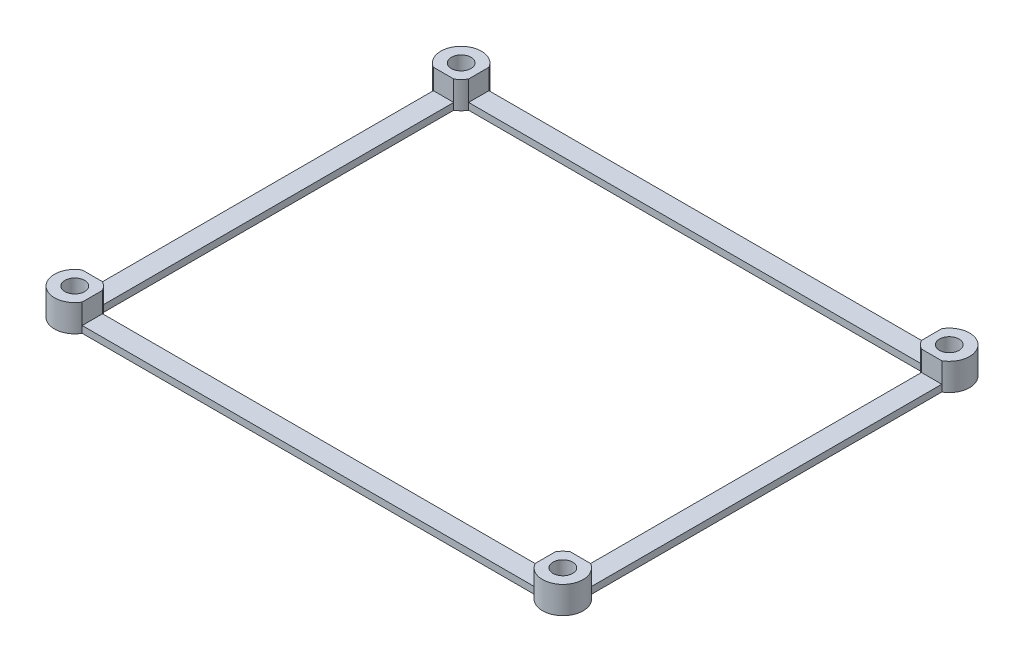
ISO-10303-21;
HEADER;
FILE_DESCRIPTION(('STEP AP214'),'2;1');
FILE_NAME('part.step','',(''),(''),'','','');
FILE_SCHEMA(('AUTOMOTIVE_DESIGN { 1 0 10303 214 1 1 1 1 }'));
ENDSEC;
DATA;
#1=APPLICATION_CONTEXT('core data for automotive mechanical design processes');
#2=APPLICATION_PROTOCOL_DEFINITION('international standard','automotive_design',2000,#1);
#3=PRODUCT_CONTEXT('',#1,'mechanical');
#4=PRODUCT('Part','Part','',(#3));
#5=PRODUCT_RELATED_PRODUCT_CATEGORY('part','',(#4));
#6=PRODUCT_DEFINITION_FORMATION('','',#4);
#7=PRODUCT_DEFINITION_CONTEXT('part definition',#1,'design');
#8=PRODUCT_DEFINITION('design','',#6,#7);
#9=PRODUCT_DEFINITION_SHAPE('','',#8);
#10=(LENGTH_UNIT() NAMED_UNIT(*) SI_UNIT(.MILLI.,.METRE.));
#11=(NAMED_UNIT(*) PLANE_ANGLE_UNIT() SI_UNIT($,.RADIAN.));
#12=(NAMED_UNIT(*) SI_UNIT($,.STERADIAN.) SOLID_ANGLE_UNIT());
#13=UNCERTAINTY_MEASURE_WITH_UNIT(LENGTH_MEASURE(1.E-05),#10,'distance_accuracy_value','');
#14=(GEOMETRIC_REPRESENTATION_CONTEXT(3) GLOBAL_UNCERTAINTY_ASSIGNED_CONTEXT((#13)) GLOBAL_UNIT_ASSIGNED_CONTEXT((#10,
#11,#12)) REPRESENTATION_CONTEXT('',''));
#15=CARTESIAN_POINT('',(0.,0.,0.));
#16=DIRECTION('',(0.,0.,1.));
#17=DIRECTION('',(1.,0.,0.));
#18=AXIS2_PLACEMENT_3D('',#15,#16,#17);
#19=CARTESIAN_POINT('',(36.,4.,-28.5));
#20=DIRECTION('',(0.,1.,0.));
#21=DIRECTION('',(0.,0.,1.));
#22=AXIS2_PLACEMENT_3D('',#19,#20,#21);
#23=PLANE('',#22);
#24=DIRECTION('',(-1.,0.,0.));
#25=VECTOR('',#24,1.);
#26=CARTESIAN_POINT('',(-37.5,4.,-25.9019237886467));
#27=LINE('',#26,#25);
#28=CARTESIAN_POINT('',(-34.5,4.,-25.9019237886467));
#29=VERTEX_POINT('',#28);
#30=CARTESIAN_POINT('',(-37.5,4.,-25.9019237886467));
#31=VERTEX_POINT('',#30);
#32=EDGE_CURVE('E224',#29,#31,#27,.T.);
#33=ORIENTED_EDGE('',*,*,#32,.F.);
#34=CARTESIAN_POINT('',(-36.,4.,-28.5));
#35=DIRECTION('',(0.,-1.,0.));
#36=DIRECTION('',(0.,0.,1.));
#37=AXIS2_PLACEMENT_3D('',#34,#35,#36);
#38=CIRCLE('',#37,3.);
#39=CARTESIAN_POINT('',(-33.4019237886467,4.,-27.));
#40=VERTEX_POINT('',#39);
#41=EDGE_CURVE('E323',#40,#29,#38,.T.);
#42=ORIENTED_EDGE('',*,*,#41,.F.);
#43=DIRECTION('',(0.,0.,1.));
#44=VECTOR('',#43,1.);
#45=CARTESIAN_POINT('',(-33.4019237886467,4.,-27.));
#46=LINE('',#45,#44);
#47=CARTESIAN_POINT('',(-33.4019237886467,4.,-30.));
#48=VERTEX_POINT('',#47);
#49=EDGE_CURVE('E322',#48,#40,#46,.T.);
#50=ORIENTED_EDGE('',*,*,#49,.F.);
#51=CARTESIAN_POINT('',(-36.,4.,-28.5));
#52=DIRECTION('',(0.,1.,0.));
#53=DIRECTION('',(0.,0.,1.));
#54=AXIS2_PLACEMENT_3D('',#51,#52,#53);
#55=CIRCLE('',#54,3.);
#56=EDGE_CURVE('E233',#48,#31,#55,.T.);
#57=ORIENTED_EDGE('',*,*,#56,.T.);
#58=EDGE_LOOP('',(#33,#42,#50,#57));
#59=FACE_BOUND('',#58,.T.);
#60=CARTESIAN_POINT('',(-36.,4.,-28.5));
#61=DIRECTION('',(0.,1.,0.));
#62=DIRECTION('',(0.,0.,1.));
#63=AXIS2_PLACEMENT_3D('',#60,#61,#62);
#64=CIRCLE('',#63,1.45);
#65=CARTESIAN_POINT('',(-36.,4.,-27.05));
#66=VERTEX_POINT('',#65);
#67=EDGE_CURVE('E395',#66,#66,#64,.T.);
#68=ORIENTED_EDGE('',*,*,#67,.F.);
#69=EDGE_LOOP('',(#68));
#70=FACE_BOUND('',#69,.T.);
#71=ADVANCED_FACE('F39',(#59,#70),#23,.T.);
#72=DIRECTION('',(1.,0.,0.));
#73=VECTOR('',#72,1.);
#74=CARTESIAN_POINT('',(-37.5,4.,25.9019237886467));
#75=LINE('',#74,#73);
#76=CARTESIAN_POINT('',(-37.5,4.,25.9019237886467));
#77=VERTEX_POINT('',#76);
#78=CARTESIAN_POINT('',(-34.5,4.,25.9019237886467));
#79=VERTEX_POINT('',#78);
#80=EDGE_CURVE('E204',#77,#79,#75,.T.);
#81=ORIENTED_EDGE('',*,*,#80,.F.);
#82=CARTESIAN_POINT('',(-36.,4.,28.5));
#83=DIRECTION('',(0.,1.,0.));
#84=DIRECTION('',(0.,0.,1.));
#85=AXIS2_PLACEMENT_3D('',#82,#83,#84);
#86=CIRCLE('',#85,3.00000000000001);
#87=CARTESIAN_POINT('',(-33.4019237886467,4.,30.));
#88=VERTEX_POINT('',#87);
#89=EDGE_CURVE('E220',#77,#88,#86,.T.);
#90=ORIENTED_EDGE('',*,*,#89,.T.);
#91=DIRECTION('',(0.,0.,1.));
#92=VECTOR('',#91,1.);
#93=CARTESIAN_POINT('',(-33.4019237886467,4.,27.));
#94=LINE('',#93,#92);
#95=CARTESIAN_POINT('',(-33.4019237886467,4.,27.));
#96=VERTEX_POINT('',#95);
#97=EDGE_CURVE('E438',#96,#88,#94,.T.);
#98=ORIENTED_EDGE('',*,*,#97,.F.);
#99=CARTESIAN_POINT('',(-36.,4.,28.5));
#100=DIRECTION('',(0.,-1.,0.));
#101=DIRECTION('',(0.,0.,1.));
#102=AXIS2_PLACEMENT_3D('',#99,#100,#101);
#103=CIRCLE('',#102,3.00000000000001);
#104=EDGE_CURVE('E223',#79,#96,#103,.T.);
#105=ORIENTED_EDGE('',*,*,#104,.F.);
#106=EDGE_LOOP('',(#81,#90,#98,#105));
#107=FACE_BOUND('',#106,.T.);
#108=CARTESIAN_POINT('',(-36.,4.,28.5));
#109=DIRECTION('',(0.,1.,0.));
#110=DIRECTION('',(0.,0.,1.));
#111=AXIS2_PLACEMENT_3D('',#108,#109,#110);
#112=CIRCLE('',#111,1.45);
#113=CARTESIAN_POINT('',(-36.,4.,29.95));
#114=VERTEX_POINT('',#113);
#115=EDGE_CURVE('E401',#114,#114,#112,.T.);
#116=ORIENTED_EDGE('',*,*,#115,.F.);
#117=EDGE_LOOP('',(#116));
#118=FACE_BOUND('',#117,.T.);
#119=ADVANCED_FACE('F217',(#107,#118),#23,.T.);
#120=DIRECTION('',(-1.,0.,0.));
#121=VECTOR('',#120,1.);
#122=CARTESIAN_POINT('',(34.5,4.,-25.9019237886467));
#123=LINE('',#122,#121);
#124=CARTESIAN_POINT('',(37.5,4.,-25.9019237886467));
#125=VERTEX_POINT('',#124);
#126=CARTESIAN_POINT('',(34.5,4.,-25.9019237886467));
#127=VERTEX_POINT('',#126);
#128=EDGE_CURVE('E425',#125,#127,#123,.T.);
#129=ORIENTED_EDGE('',*,*,#128,.F.);
#130=CARTESIAN_POINT('',(36.,4.,-28.5));
#131=DIRECTION('',(0.,1.,0.));
#132=DIRECTION('',(0.,0.,1.));
#133=AXIS2_PLACEMENT_3D('',#130,#131,#132);
#134=CIRCLE('',#133,3.);
#135=CARTESIAN_POINT('',(33.4019237886467,4.,-30.));
#136=VERTEX_POINT('',#135);
#137=EDGE_CURVE('E239',#125,#136,#134,.T.);
#138=ORIENTED_EDGE('',*,*,#137,.T.);
#139=DIRECTION('',(0.,0.,-1.));
#140=VECTOR('',#139,1.);
#141=CARTESIAN_POINT('',(33.4019237886467,4.,-27.));
#142=LINE('',#141,#140);
#143=CARTESIAN_POINT('',(33.4019237886467,4.,-27.));
#144=VERTEX_POINT('',#143);
#145=EDGE_CURVE('E325',#144,#136,#142,.T.);
#146=ORIENTED_EDGE('',*,*,#145,.F.);
#147=CARTESIAN_POINT('',(36.,4.,-28.5));
#148=DIRECTION('',(0.,-1.,0.));
#149=DIRECTION('',(0.,0.,1.));
#150=AXIS2_PLACEMENT_3D('',#147,#148,#149);
#151=CIRCLE('',#150,3.);
#152=EDGE_CURVE('E342',#127,#144,#151,.T.);
#153=ORIENTED_EDGE('',*,*,#152,.F.);
#154=EDGE_LOOP('',(#129,#138,#146,#153));
#155=FACE_BOUND('',#154,.T.);
#156=CARTESIAN_POINT('',(36.,4.,-28.5));
#157=DIRECTION('',(0.,1.,0.));
#158=DIRECTION('',(0.,0.,1.));
#159=AXIS2_PLACEMENT_3D('',#156,#157,#158);
#160=CIRCLE('',#159,1.45);
#161=CARTESIAN_POINT('',(36.,4.,-27.05));
#162=VERTEX_POINT('',#161);
#163=EDGE_CURVE('E247',#162,#162,#160,.T.);
#164=ORIENTED_EDGE('',*,*,#163,.F.);
#165=EDGE_LOOP('',(#164));
#166=FACE_BOUND('',#165,.T.);
#167=ADVANCED_FACE('F422',(#155,#166),#23,.T.);
#168=CARTESIAN_POINT('',(-33.4019237886467,4.,-30.));
#169=DIRECTION('',(0.,0.,1.));
#170=DIRECTION('',(1.,0.,0.));
#171=AXIS2_PLACEMENT_3D('',#168,#169,#170);
#172=PLANE('',#171);
#173=DIRECTION('',(1.,0.,0.));
#174=VECTOR('',#173,1.);
#175=CARTESIAN_POINT('',(33.4019237886467,1.,-30.));
#176=LINE('',#175,#174);
#177=CARTESIAN_POINT('',(-33.4019237886467,1.,-30.));
#178=VERTEX_POINT('',#177);
#179=CARTESIAN_POINT('',(33.4019237886467,1.,-30.));
#180=VERTEX_POINT('',#179);
#181=EDGE_CURVE('E332',#178,#180,#176,.T.);
#182=ORIENTED_EDGE('',*,*,#181,.T.);
#183=DIRECTION('',(0.,-1.,0.));
#184=VECTOR('',#183,1.);
#185=CARTESIAN_POINT('',(33.4019237886467,4.,-30.));
#186=LINE('',#185,#184);
#187=CARTESIAN_POINT('',(33.4019237886467,0.,-30.));
#188=VERTEX_POINT('',#187);
#189=EDGE_CURVE('E47',#180,#188,#186,.T.);
#190=ORIENTED_EDGE('',*,*,#189,.T.);
#191=DIRECTION('',(-1.,0.,0.));
#192=VECTOR('',#191,1.);
#193=CARTESIAN_POINT('',(-33.4019237886467,0.,-30.));
#194=LINE('',#193,#192);
#195=CARTESIAN_POINT('',(-33.4019237886467,0.,-30.));
#196=VERTEX_POINT('',#195);
#197=EDGE_CURVE('E246',#188,#196,#194,.T.);
#198=ORIENTED_EDGE('',*,*,#197,.T.);
#199=DIRECTION('',(0.,-1.,0.));
#200=VECTOR('',#199,1.);
#201=CARTESIAN_POINT('',(-33.4019237886467,4.,-30.));
#202=LINE('',#201,#200);
#203=EDGE_CURVE('E281',#178,#196,#202,.T.);
#204=ORIENTED_EDGE('',*,*,#203,.F.);
#205=EDGE_LOOP('',(#182,#190,#198,#204));
#206=FACE_BOUND('',#205,.T.);
#207=ADVANCED_FACE('F294',(#206),#172,.F.);
#208=CARTESIAN_POINT('',(-37.5,4.,25.9019237886467));
#209=DIRECTION('',(1.,0.,0.));
#210=DIRECTION('',(0.,0.,-1.));
#211=AXIS2_PLACEMENT_3D('',#208,#209,#210);
#212=PLANE('',#211);
#213=DIRECTION('',(0.,0.,-1.));
#214=VECTOR('',#213,1.);
#215=CARTESIAN_POINT('',(-37.5,1.,-25.9019237886467));
#216=LINE('',#215,#214);
#217=CARTESIAN_POINT('',(-37.5,1.,25.9019237886467));
#218=VERTEX_POINT('',#217);
#219=CARTESIAN_POINT('',(-37.5,1.,-25.9019237886467));
#220=VERTEX_POINT('',#219);
#221=EDGE_CURVE('E306',#218,#220,#216,.T.);
#222=ORIENTED_EDGE('',*,*,#221,.T.);
#223=DIRECTION('',(0.,-1.,0.));
#224=VECTOR('',#223,1.);
#225=CARTESIAN_POINT('',(-37.5,4.,-25.9019237886467));
#226=LINE('',#225,#224);
#227=CARTESIAN_POINT('',(-37.5,0.,-25.9019237886467));
#228=VERTEX_POINT('',#227);
#229=EDGE_CURVE('E211',#220,#228,#226,.T.);
#230=ORIENTED_EDGE('',*,*,#229,.T.);
#231=DIRECTION('',(0.,0.,1.));
#232=VECTOR('',#231,1.);
#233=CARTESIAN_POINT('',(-37.5,0.,25.9019237886467));
#234=LINE('',#233,#232);
#235=CARTESIAN_POINT('',(-37.5,0.,25.9019237886467));
#236=VERTEX_POINT('',#235);
#237=EDGE_CURVE('E253',#228,#236,#234,.T.);
#238=ORIENTED_EDGE('',*,*,#237,.T.);
#239=DIRECTION('',(0.,-1.,0.));
#240=VECTOR('',#239,1.);
#241=CARTESIAN_POINT('',(-37.5,4.,25.9019237886467));
#242=LINE('',#241,#240);
#243=EDGE_CURVE('E212',#218,#236,#242,.T.);
#244=ORIENTED_EDGE('',*,*,#243,.F.);
#245=EDGE_LOOP('',(#222,#230,#238,#244));
#246=FACE_BOUND('',#245,.T.);
#247=ADVANCED_FACE('F305',(#246),#212,.F.);
#248=CARTESIAN_POINT('',(-33.4019237886467,4.,30.));
#249=DIRECTION('',(0.,0.,-1.));
#250=DIRECTION('',(-1.,0.,0.));
#251=AXIS2_PLACEMENT_3D('',#248,#249,#250);
#252=PLANE('',#251);
#253=DIRECTION('',(-1.,0.,0.));
#254=VECTOR('',#253,1.);
#255=CARTESIAN_POINT('',(-33.4019237886467,1.,30.));
#256=LINE('',#255,#254);
#257=CARTESIAN_POINT('',(33.4019237886467,1.,30.));
#258=VERTEX_POINT('',#257);
#259=CARTESIAN_POINT('',(-33.4019237886467,1.,30.));
#260=VERTEX_POINT('',#259);
#261=EDGE_CURVE('E225',#258,#260,#256,.T.);
#262=ORIENTED_EDGE('',*,*,#261,.T.);
#263=DIRECTION('',(0.,-1.,0.));
#264=VECTOR('',#263,1.);
#265=CARTESIAN_POINT('',(-33.4019237886467,4.,30.));
#266=LINE('',#265,#264);
#267=CARTESIAN_POINT('',(-33.4019237886467,0.,30.));
#268=VERTEX_POINT('',#267);
#269=EDGE_CURVE('E277',#260,#268,#266,.T.);
#270=ORIENTED_EDGE('',*,*,#269,.T.);
#271=DIRECTION('',(1.,0.,0.));
#272=VECTOR('',#271,1.);
#273=CARTESIAN_POINT('',(-33.4019237886467,0.,30.));
#274=LINE('',#273,#272);
#275=CARTESIAN_POINT('',(33.4019237886467,0.,30.));
#276=VERTEX_POINT('',#275);
#277=EDGE_CURVE('E258',#268,#276,#274,.T.);
#278=ORIENTED_EDGE('',*,*,#277,.T.);
#279=DIRECTION('',(0.,-1.,0.));
#280=VECTOR('',#279,1.);
#281=CARTESIAN_POINT('',(33.4019237886467,4.,30.));
#282=LINE('',#281,#280);
#283=EDGE_CURVE('E273',#258,#276,#282,.T.);
#284=ORIENTED_EDGE('',*,*,#283,.F.);
#285=EDGE_LOOP('',(#262,#270,#278,#284));
#286=FACE_BOUND('',#285,.T.);
#287=ADVANCED_FACE('F520',(#286),#252,.F.);
#288=CARTESIAN_POINT('',(37.5,4.,25.9019237886467));
#289=DIRECTION('',(-1.,0.,0.));
#290=DIRECTION('',(0.,0.,1.));
#291=AXIS2_PLACEMENT_3D('',#288,#289,#290);
#292=PLANE('',#291);
#293=DIRECTION('',(0.,0.,1.));
#294=VECTOR('',#293,1.);
#295=CARTESIAN_POINT('',(37.5,1.,25.9019237886467));
#296=LINE('',#295,#294);
#297=CARTESIAN_POINT('',(37.5,1.,-25.9019237886467));
#298=VERTEX_POINT('',#297);
#299=CARTESIAN_POINT('',(37.5,1.,25.9019237886467));
#300=VERTEX_POINT('',#299);
#301=EDGE_CURVE('E441',#298,#300,#296,.T.);
#302=ORIENTED_EDGE('',*,*,#301,.T.);
#303=DIRECTION('',(0.,-1.,0.));
#304=VECTOR('',#303,1.);
#305=CARTESIAN_POINT('',(37.5,4.,25.9019237886467));
#306=LINE('',#305,#304);
#307=CARTESIAN_POINT('',(37.5,0.,25.9019237886467));
#308=VERTEX_POINT('',#307);
#309=EDGE_CURVE('E270',#300,#308,#306,.T.);
#310=ORIENTED_EDGE('',*,*,#309,.T.);
#311=DIRECTION('',(0.,0.,-1.));
#312=VECTOR('',#311,1.);
#313=CARTESIAN_POINT('',(37.5,0.,25.9019237886467));
#314=LINE('',#313,#312);
#315=CARTESIAN_POINT('',(37.5,0.,-25.9019237886467));
#316=VERTEX_POINT('',#315);
#317=EDGE_CURVE('E264',#308,#316,#314,.T.);
#318=ORIENTED_EDGE('',*,*,#317,.T.);
#319=DIRECTION('',(0.,-1.,0.));
#320=VECTOR('',#319,1.);
#321=CARTESIAN_POINT('',(37.5,4.,-25.9019237886467));
#322=LINE('',#321,#320);
#323=EDGE_CURVE('E236',#298,#316,#322,.T.);
#324=ORIENTED_EDGE('',*,*,#323,.F.);
#325=EDGE_LOOP('',(#302,#310,#318,#324));
#326=FACE_BOUND('',#325,.T.);
#327=ADVANCED_FACE('F530',(#326),#292,.F.);
#328=CARTESIAN_POINT('',(-34.5,4.,25.9019237886467));
#329=DIRECTION('',(1.,0.,0.));
#330=DIRECTION('',(0.,0.,-1.));
#331=AXIS2_PLACEMENT_3D('',#328,#329,#330);
#332=PLANE('',#331);
#333=DIRECTION('',(0.,-1.,0.));
#334=VECTOR('',#333,1.);
#335=CARTESIAN_POINT('',(-34.5,4.,-25.9019237886467));
#336=LINE('',#335,#334);
#337=CARTESIAN_POINT('',(-34.5,1.,-25.9019237886467));
#338=VERTEX_POINT('',#337);
#339=CARTESIAN_POINT('',(-34.5,0.,-25.9019237886467));
#340=VERTEX_POINT('',#339);
#341=EDGE_CURVE('E392',#338,#340,#336,.T.);
#342=ORIENTED_EDGE('',*,*,#341,.F.);
#343=DIRECTION('',(0.,0.,1.));
#344=VECTOR('',#343,1.);
#345=CARTESIAN_POINT('',(-34.5,1.,-25.9019237886467));
#346=LINE('',#345,#344);
#347=CARTESIAN_POINT('',(-34.5,1.,25.9019237886467));
#348=VERTEX_POINT('',#347);
#349=EDGE_CURVE('E318',#338,#348,#346,.T.);
#350=ORIENTED_EDGE('',*,*,#349,.T.);
#351=DIRECTION('',(0.,-1.,0.));
#352=VECTOR('',#351,1.);
#353=CARTESIAN_POINT('',(-34.5,4.,25.9019237886467));
#354=LINE('',#353,#352);
#355=CARTESIAN_POINT('',(-34.5,0.,25.9019237886467));
#356=VERTEX_POINT('',#355);
#357=EDGE_CURVE('E389',#348,#356,#354,.T.);
#358=ORIENTED_EDGE('',*,*,#357,.T.);
#359=DIRECTION('',(0.,0.,1.));
#360=VECTOR('',#359,1.);
#361=CARTESIAN_POINT('',(-34.5,0.,25.9019237886467));
#362=LINE('',#361,#360);
#363=EDGE_CURVE('E348',#340,#356,#362,.T.);
#364=ORIENTED_EDGE('',*,*,#363,.F.);
#365=EDGE_LOOP('',(#342,#350,#358,#364));
#366=FACE_BOUND('',#365,.T.);
#367=ADVANCED_FACE('F468',(#366),#332,.T.);
#368=CARTESIAN_POINT('',(-33.4019237886467,4.,27.));
#369=DIRECTION('',(0.,0.,-1.));
#370=DIRECTION('',(-1.,0.,0.));
#371=AXIS2_PLACEMENT_3D('',#368,#369,#370);
#372=PLANE('',#371);
#373=DIRECTION('',(0.,-1.,0.));
#374=VECTOR('',#373,1.);
#375=CARTESIAN_POINT('',(-33.4019237886467,4.,27.));
#376=LINE('',#375,#374);
#377=CARTESIAN_POINT('',(-33.4019237886467,1.,27.));
#378=VERTEX_POINT('',#377);
#379=CARTESIAN_POINT('',(-33.4019237886467,0.,27.));
#380=VERTEX_POINT('',#379);
#381=EDGE_CURVE('E385',#378,#380,#376,.T.);
#382=ORIENTED_EDGE('',*,*,#381,.F.);
#383=DIRECTION('',(1.,0.,0.));
#384=VECTOR('',#383,1.);
#385=CARTESIAN_POINT('',(-33.4019237886467,1.,27.));
#386=LINE('',#385,#384);
#387=CARTESIAN_POINT('',(33.4019237886467,1.,27.));
#388=VERTEX_POINT('',#387);
#389=EDGE_CURVE('E457',#378,#388,#386,.T.);
#390=ORIENTED_EDGE('',*,*,#389,.T.);
#391=DIRECTION('',(0.,-1.,0.));
#392=VECTOR('',#391,1.);
#393=CARTESIAN_POINT('',(33.4019237886467,4.,27.));
#394=LINE('',#393,#392);
#395=CARTESIAN_POINT('',(33.4019237886467,0.,27.));
#396=VERTEX_POINT('',#395);
#397=EDGE_CURVE('E381',#388,#396,#394,.T.);
#398=ORIENTED_EDGE('',*,*,#397,.T.);
#399=DIRECTION('',(1.,0.,0.));
#400=VECTOR('',#399,1.);
#401=CARTESIAN_POINT('',(-33.4019237886467,0.,27.));
#402=LINE('',#401,#400);
#403=EDGE_CURVE('E354',#380,#396,#402,.T.);
#404=ORIENTED_EDGE('',*,*,#403,.F.);
#405=EDGE_LOOP('',(#382,#390,#398,#404));
#406=FACE_BOUND('',#405,.T.);
#407=ADVANCED_FACE('F540',(#406),#372,.T.);
#408=CARTESIAN_POINT('',(34.5,4.,25.9019237886467));
#409=DIRECTION('',(-1.,0.,0.));
#410=DIRECTION('',(0.,0.,1.));
#411=AXIS2_PLACEMENT_3D('',#408,#409,#410);
#412=PLANE('',#411);
#413=DIRECTION('',(0.,-1.,0.));
#414=VECTOR('',#413,1.);
#415=CARTESIAN_POINT('',(34.5,4.,25.9019237886467));
#416=LINE('',#415,#414);
#417=CARTESIAN_POINT('',(34.5,1.,25.9019237886467));
#418=VERTEX_POINT('',#417);
#419=CARTESIAN_POINT('',(34.5,0.,25.9019237886467));
#420=VERTEX_POINT('',#419);
#421=EDGE_CURVE('E377',#418,#420,#416,.T.);
#422=ORIENTED_EDGE('',*,*,#421,.F.);
#423=DIRECTION('',(0.,0.,-1.));
#424=VECTOR('',#423,1.);
#425=CARTESIAN_POINT('',(34.5,1.,25.9019237886467));
#426=LINE('',#425,#424);
#427=CARTESIAN_POINT('',(34.5,1.,-25.9019237886467));
#428=VERTEX_POINT('',#427);
#429=EDGE_CURVE('E439',#418,#428,#426,.T.);
#430=ORIENTED_EDGE('',*,*,#429,.T.);
#431=DIRECTION('',(0.,-1.,0.));
#432=VECTOR('',#431,1.);
#433=CARTESIAN_POINT('',(34.5,4.,-25.9019237886467));
#434=LINE('',#433,#432);
#435=CARTESIAN_POINT('',(34.5,0.,-25.9019237886467));
#436=VERTEX_POINT('',#435);
#437=EDGE_CURVE('E373',#428,#436,#434,.T.);
#438=ORIENTED_EDGE('',*,*,#437,.T.);
#439=DIRECTION('',(0.,0.,-1.));
#440=VECTOR('',#439,1.);
#441=CARTESIAN_POINT('',(34.5,0.,25.9019237886467));
#442=LINE('',#441,#440);
#443=EDGE_CURVE('E360',#420,#436,#442,.T.);
#444=ORIENTED_EDGE('',*,*,#443,.F.);
#445=EDGE_LOOP('',(#422,#430,#438,#444));
#446=FACE_BOUND('',#445,.T.);
#447=ADVANCED_FACE('F509',(#446),#412,.T.);
#448=CARTESIAN_POINT('',(-33.4019237886467,4.,-27.));
#449=DIRECTION('',(0.,0.,1.));
#450=DIRECTION('',(1.,0.,0.));
#451=AXIS2_PLACEMENT_3D('',#448,#449,#450);
#452=PLANE('',#451);
#453=DIRECTION('',(0.,-1.,0.));
#454=VECTOR('',#453,1.);
#455=CARTESIAN_POINT('',(33.4019237886467,4.,-27.));
#456=LINE('',#455,#454);
#457=CARTESIAN_POINT('',(33.4019237886467,1.,-27.));
#458=VERTEX_POINT('',#457);
#459=CARTESIAN_POINT('',(33.4019237886467,0.,-27.));
#460=VERTEX_POINT('',#459);
#461=EDGE_CURVE('E369',#458,#460,#456,.T.);
#462=ORIENTED_EDGE('',*,*,#461,.F.);
#463=DIRECTION('',(-1.,0.,0.));
#464=VECTOR('',#463,1.);
#465=CARTESIAN_POINT('',(33.4019237886467,1.,-27.));
#466=LINE('',#465,#464);
#467=CARTESIAN_POINT('',(-33.4019237886467,1.,-27.));
#468=VERTEX_POINT('',#467);
#469=EDGE_CURVE('E327',#458,#468,#466,.T.);
#470=ORIENTED_EDGE('',*,*,#469,.T.);
#471=DIRECTION('',(0.,-1.,0.));
#472=VECTOR('',#471,1.);
#473=CARTESIAN_POINT('',(-33.4019237886467,4.,-27.));
#474=LINE('',#473,#472);
#475=CARTESIAN_POINT('',(-33.4019237886467,0.,-27.));
#476=VERTEX_POINT('',#475);
#477=EDGE_CURVE('E62',#468,#476,#474,.T.);
#478=ORIENTED_EDGE('',*,*,#477,.T.);
#479=DIRECTION('',(-1.,0.,0.));
#480=VECTOR('',#479,1.);
#481=CARTESIAN_POINT('',(-33.4019237886467,0.,-27.));
#482=LINE('',#481,#480);
#483=EDGE_CURVE('E337',#460,#476,#482,.T.);
#484=ORIENTED_EDGE('',*,*,#483,.F.);
#485=EDGE_LOOP('',(#462,#470,#478,#484));
#486=FACE_BOUND('',#485,.T.);
#487=ADVANCED_FACE('F501',(#486),#452,.T.);
#488=DIRECTION('',(0.,0.,-1.));
#489=VECTOR('',#488,1.);
#490=CARTESIAN_POINT('',(33.4019237886467,4.,27.));
#491=LINE('',#490,#489);
#492=CARTESIAN_POINT('',(33.4019237886467,4.,30.));
#493=VERTEX_POINT('',#492);
#494=CARTESIAN_POINT('',(33.4019237886467,4.,27.));
#495=VERTEX_POINT('',#494);
#496=EDGE_CURVE('E452',#493,#495,#491,.T.);
#497=ORIENTED_EDGE('',*,*,#496,.F.);
#498=CARTESIAN_POINT('',(36.,4.,28.5));
#499=DIRECTION('',(0.,1.,0.));
#500=DIRECTION('',(0.,0.,1.));
#501=AXIS2_PLACEMENT_3D('',#498,#499,#500);
#502=CIRCLE('',#501,3.);
#503=CARTESIAN_POINT('',(37.5,4.,25.9019237886467));
#504=VERTEX_POINT('',#503);
#505=EDGE_CURVE('E232',#493,#504,#502,.T.);
#506=ORIENTED_EDGE('',*,*,#505,.T.);
#507=DIRECTION('',(1.,0.,0.));
#508=VECTOR('',#507,1.);
#509=CARTESIAN_POINT('',(34.5,4.,25.9019237886467));
#510=LINE('',#509,#508);
#511=CARTESIAN_POINT('',(34.5,4.,25.9019237886467));
#512=VERTEX_POINT('',#511);
#513=EDGE_CURVE('E334',#512,#504,#510,.T.);
#514=ORIENTED_EDGE('',*,*,#513,.F.);
#515=CARTESIAN_POINT('',(36.,4.,28.5));
#516=DIRECTION('',(0.,-1.,0.));
#517=DIRECTION('',(0.,0.,1.));
#518=AXIS2_PLACEMENT_3D('',#515,#516,#517);
#519=CIRCLE('',#518,3.);
#520=EDGE_CURVE('E339',#495,#512,#519,.T.);
#521=ORIENTED_EDGE('',*,*,#520,.F.);
#522=EDGE_LOOP('',(#497,#506,#514,#521));
#523=FACE_BOUND('',#522,.T.);
#524=CARTESIAN_POINT('',(36.,4.,28.5));
#525=DIRECTION('',(0.,1.,0.));
#526=DIRECTION('',(0.,0.,1.));
#527=AXIS2_PLACEMENT_3D('',#524,#525,#526);
#528=CIRCLE('',#527,1.45);
#529=CARTESIAN_POINT('',(36.,4.,29.95));
#530=VERTEX_POINT('',#529);
#531=EDGE_CURVE('E407',#530,#530,#528,.T.);
#532=ORIENTED_EDGE('',*,*,#531,.F.);
#533=EDGE_LOOP('',(#532));
#534=FACE_BOUND('',#533,.T.);
#535=ADVANCED_FACE('F494',(#523,#534),#23,.T.);
#536=CARTESIAN_POINT('',(36.,0.,-28.5));
#537=DIRECTION('',(0.,1.,0.));
#538=DIRECTION('',(0.,0.,1.));
#539=AXIS2_PLACEMENT_3D('',#536,#537,#538);
#540=PLANE('',#539);
#541=CARTESIAN_POINT('',(-36.,0.,-28.5));
#542=DIRECTION('',(0.,1.,0.));
#543=DIRECTION('',(0.,0.,1.));
#544=AXIS2_PLACEMENT_3D('',#541,#542,#543);
#545=CIRCLE('',#544,1.45);
#546=CARTESIAN_POINT('',(-36.,0.,-27.05));
#547=VERTEX_POINT('',#546);
#548=EDGE_CURVE('E394',#547,#547,#545,.T.);
#549=ORIENTED_EDGE('',*,*,#548,.T.);
#550=EDGE_LOOP('',(#549));
#551=FACE_BOUND('',#550,.T.);
#552=CARTESIAN_POINT('',(-36.,0.,28.5));
#553=DIRECTION('',(0.,1.,0.));
#554=DIRECTION('',(0.,0.,1.));
#555=AXIS2_PLACEMENT_3D('',#552,#553,#554);
#556=CIRCLE('',#555,1.45);
#557=CARTESIAN_POINT('',(-36.,0.,29.95));
#558=VERTEX_POINT('',#557);
#559=EDGE_CURVE('E398',#558,#558,#556,.T.);
#560=ORIENTED_EDGE('',*,*,#559,.T.);
#561=EDGE_LOOP('',(#560));
#562=FACE_BOUND('',#561,.T.);
#563=CARTESIAN_POINT('',(36.,0.,28.5));
#564=DIRECTION('',(0.,1.,0.));
#565=DIRECTION('',(0.,0.,1.));
#566=AXIS2_PLACEMENT_3D('',#563,#564,#565);
#567=CIRCLE('',#566,1.45);
#568=CARTESIAN_POINT('',(36.,0.,29.95));
#569=VERTEX_POINT('',#568);
#570=EDGE_CURVE('E404',#569,#569,#567,.T.);
#571=ORIENTED_EDGE('',*,*,#570,.T.);
#572=EDGE_LOOP('',(#571));
#573=FACE_BOUND('',#572,.T.);
#574=CARTESIAN_POINT('',(36.,0.,-28.5));
#575=DIRECTION('',(0.,1.,0.));
#576=DIRECTION('',(0.,0.,1.));
#577=AXIS2_PLACEMENT_3D('',#574,#575,#576);
#578=CIRCLE('',#577,1.45);
#579=CARTESIAN_POINT('',(36.,0.,-27.05));
#580=VERTEX_POINT('',#579);
#581=EDGE_CURVE('E410',#580,#580,#578,.T.);
#582=ORIENTED_EDGE('',*,*,#581,.T.);
#583=EDGE_LOOP('',(#582));
#584=FACE_BOUND('',#583,.T.);
#585=CARTESIAN_POINT('',(36.,0.,-28.5));
#586=DIRECTION('',(0.,1.,0.));
#587=DIRECTION('',(0.,0.,1.));
#588=AXIS2_PLACEMENT_3D('',#585,#586,#587);
#589=CIRCLE('',#588,3.);
#590=EDGE_CURVE('E243',#316,#188,#589,.T.);
#591=ORIENTED_EDGE('',*,*,#590,.F.);
#592=ORIENTED_EDGE('',*,*,#317,.F.);
#593=CARTESIAN_POINT('',(36.,0.,28.5));
#594=DIRECTION('',(0.,1.,0.));
#595=DIRECTION('',(0.,0.,1.));
#596=AXIS2_PLACEMENT_3D('',#593,#594,#595);
#597=CIRCLE('',#596,3.);
#598=EDGE_CURVE('E261',#276,#308,#597,.T.);
#599=ORIENTED_EDGE('',*,*,#598,.F.);
#600=ORIENTED_EDGE('',*,*,#277,.F.);
#601=CARTESIAN_POINT('',(-36.,0.,28.5));
#602=DIRECTION('',(0.,1.,0.));
#603=DIRECTION('',(0.,0.,1.));
#604=AXIS2_PLACEMENT_3D('',#601,#602,#603);
#605=CIRCLE('',#604,3.00000000000001);
#606=EDGE_CURVE('E256',#236,#268,#605,.T.);
#607=ORIENTED_EDGE('',*,*,#606,.F.);
#608=ORIENTED_EDGE('',*,*,#237,.F.);
#609=CARTESIAN_POINT('',(-36.,0.,-28.5));
#610=DIRECTION('',(0.,1.,0.));
#611=DIRECTION('',(0.,0.,1.));
#612=AXIS2_PLACEMENT_3D('',#609,#610,#611);
#613=CIRCLE('',#612,3.);
#614=EDGE_CURVE('E250',#196,#228,#613,.T.);
#615=ORIENTED_EDGE('',*,*,#614,.F.);
#616=ORIENTED_EDGE('',*,*,#197,.F.);
#617=EDGE_LOOP('',(#591,#592,#599,#600,#607,#608,#615,#616));
#618=FACE_BOUND('',#617,.T.);
#619=CARTESIAN_POINT('',(-36.,0.,-28.5));
#620=DIRECTION('',(0.,-1.,0.));
#621=DIRECTION('',(0.,0.,1.));
#622=AXIS2_PLACEMENT_3D('',#619,#620,#621);
#623=CIRCLE('',#622,3.);
#624=EDGE_CURVE('E345',#476,#340,#623,.T.);
#625=ORIENTED_EDGE('',*,*,#624,.T.);
#626=ORIENTED_EDGE('',*,*,#363,.T.);
#627=CARTESIAN_POINT('',(-36.,0.,28.5));
#628=DIRECTION('',(0.,-1.,0.));
#629=DIRECTION('',(0.,0.,1.));
#630=AXIS2_PLACEMENT_3D('',#627,#628,#629);
#631=CIRCLE('',#630,3.00000000000001);
#632=EDGE_CURVE('E351',#356,#380,#631,.T.);
#633=ORIENTED_EDGE('',*,*,#632,.T.);
#634=ORIENTED_EDGE('',*,*,#403,.T.);
#635=CARTESIAN_POINT('',(36.,0.,28.5));
#636=DIRECTION('',(0.,-1.,0.));
#637=DIRECTION('',(0.,0.,1.));
#638=AXIS2_PLACEMENT_3D('',#635,#636,#637);
#639=CIRCLE('',#638,3.);
#640=EDGE_CURVE('E357',#396,#420,#639,.T.);
#641=ORIENTED_EDGE('',*,*,#640,.T.);
#642=ORIENTED_EDGE('',*,*,#443,.T.);
#643=CARTESIAN_POINT('',(36.,0.,-28.5));
#644=DIRECTION('',(0.,-1.,0.));
#645=DIRECTION('',(0.,0.,1.));
#646=AXIS2_PLACEMENT_3D('',#643,#644,#645);
#647=CIRCLE('',#646,3.);
#648=EDGE_CURVE('E363',#436,#460,#647,.T.);
#649=ORIENTED_EDGE('',*,*,#648,.T.);
#650=ORIENTED_EDGE('',*,*,#483,.T.);
#651=EDGE_LOOP('',(#625,#626,#633,#634,#641,#642,#649,#650));
#652=FACE_BOUND('',#651,.T.);
#653=ADVANCED_FACE('F298',(#551,#562,#573,#584,#618,#652),#540,.F.);
#654=CARTESIAN_POINT('',(36.,4.,-28.5));
#655=DIRECTION('',(0.,-1.,0.));
#656=DIRECTION('',(0.,0.,-1.));
#657=AXIS2_PLACEMENT_3D('',#654,#655,#656);
#658=CYLINDRICAL_SURFACE('',#657,3.);
#659=ORIENTED_EDGE('',*,*,#590,.T.);
#660=ORIENTED_EDGE('',*,*,#189,.F.);
#661=EDGE_CURVE('E12',#136,#180,#186,.T.);
#662=ORIENTED_EDGE('',*,*,#661,.F.);
#663=ORIENTED_EDGE('',*,*,#137,.F.);
#664=EDGE_CURVE('E267',#125,#298,#322,.T.);
#665=ORIENTED_EDGE('',*,*,#664,.T.);
#666=ORIENTED_EDGE('',*,*,#323,.T.);
#667=EDGE_LOOP('',(#659,#660,#662,#663,#665,#666));
#668=FACE_BOUND('',#667,.T.);
#669=ADVANCED_FACE('F41',(#668),#658,.T.);
#670=CARTESIAN_POINT('',(-36.,4.,-28.5));
#671=DIRECTION('',(0.,-1.,0.));
#672=DIRECTION('',(0.,0.,-1.));
#673=AXIS2_PLACEMENT_3D('',#670,#671,#672);
#674=CYLINDRICAL_SURFACE('',#673,3.);
#675=ORIENTED_EDGE('',*,*,#614,.T.);
#676=ORIENTED_EDGE('',*,*,#229,.F.);
#677=EDGE_CURVE('E279',#31,#220,#226,.T.);
#678=ORIENTED_EDGE('',*,*,#677,.F.);
#679=ORIENTED_EDGE('',*,*,#56,.F.);
#680=EDGE_CURVE('E282',#48,#178,#202,.T.);
#681=ORIENTED_EDGE('',*,*,#680,.T.);
#682=ORIENTED_EDGE('',*,*,#203,.T.);
#683=EDGE_LOOP('',(#675,#676,#678,#679,#681,#682));
#684=FACE_BOUND('',#683,.T.);
#685=ADVANCED_FACE('F287',(#684),#674,.T.);
#686=CARTESIAN_POINT('',(-36.,4.,28.5));
#687=DIRECTION('',(0.,-1.,0.));
#688=DIRECTION('',(0.,0.,-1.));
#689=AXIS2_PLACEMENT_3D('',#686,#687,#688);
#690=CYLINDRICAL_SURFACE('',#689,3.00000000000001);
#691=ORIENTED_EDGE('',*,*,#606,.T.);
#692=ORIENTED_EDGE('',*,*,#269,.F.);
#693=EDGE_CURVE('E231',#88,#260,#266,.T.);
#694=ORIENTED_EDGE('',*,*,#693,.F.);
#695=ORIENTED_EDGE('',*,*,#89,.F.);
#696=EDGE_CURVE('E201',#77,#218,#242,.T.);
#697=ORIENTED_EDGE('',*,*,#696,.T.);
#698=ORIENTED_EDGE('',*,*,#243,.T.);
#699=EDGE_LOOP('',(#691,#692,#694,#695,#697,#698));
#700=FACE_BOUND('',#699,.T.);
#701=ADVANCED_FACE('F228',(#700),#690,.T.);
#702=CARTESIAN_POINT('',(36.,4.,28.5));
#703=DIRECTION('',(0.,-1.,0.));
#704=DIRECTION('',(0.,0.,-1.));
#705=AXIS2_PLACEMENT_3D('',#702,#703,#704);
#706=CYLINDRICAL_SURFACE('',#705,3.);
#707=ORIENTED_EDGE('',*,*,#598,.T.);
#708=ORIENTED_EDGE('',*,*,#309,.F.);
#709=EDGE_CURVE('E271',#504,#300,#306,.T.);
#710=ORIENTED_EDGE('',*,*,#709,.F.);
#711=ORIENTED_EDGE('',*,*,#505,.F.);
#712=EDGE_CURVE('E274',#493,#258,#282,.T.);
#713=ORIENTED_EDGE('',*,*,#712,.T.);
#714=ORIENTED_EDGE('',*,*,#283,.T.);
#715=EDGE_LOOP('',(#707,#708,#710,#711,#713,#714));
#716=FACE_BOUND('',#715,.T.);
#717=ADVANCED_FACE('F527',(#716),#706,.T.);
#718=CARTESIAN_POINT('',(36.,4.,-28.5));
#719=DIRECTION('',(0.,-1.,0.));
#720=DIRECTION('',(0.,0.,-1.));
#721=AXIS2_PLACEMENT_3D('',#718,#719,#720);
#722=CYLINDRICAL_SURFACE('',#721,1.45);
#723=ORIENTED_EDGE('',*,*,#163,.T.);
#724=EDGE_LOOP('',(#723));
#725=FACE_BOUND('',#724,.T.);
#726=ORIENTED_EDGE('',*,*,#581,.F.);
#727=EDGE_LOOP('',(#726));
#728=FACE_BOUND('',#727,.T.);
#729=ADVANCED_FACE('F533',(#725,#728),#722,.F.);
#730=CARTESIAN_POINT('',(36.,4.,28.5));
#731=DIRECTION('',(0.,-1.,0.));
#732=DIRECTION('',(0.,0.,-1.));
#733=AXIS2_PLACEMENT_3D('',#730,#731,#732);
#734=CYLINDRICAL_SURFACE('',#733,1.45);
#735=ORIENTED_EDGE('',*,*,#531,.T.);
#736=EDGE_LOOP('',(#735));
#737=FACE_BOUND('',#736,.T.);
#738=ORIENTED_EDGE('',*,*,#570,.F.);
#739=EDGE_LOOP('',(#738));
#740=FACE_BOUND('',#739,.T.);
#741=ADVANCED_FACE('F645',(#737,#740),#734,.F.);
#742=CARTESIAN_POINT('',(-36.,4.,28.5));
#743=DIRECTION('',(0.,-1.,0.));
#744=DIRECTION('',(0.,0.,-1.));
#745=AXIS2_PLACEMENT_3D('',#742,#743,#744);
#746=CYLINDRICAL_SURFACE('',#745,1.45);
#747=ORIENTED_EDGE('',*,*,#115,.T.);
#748=EDGE_LOOP('',(#747));
#749=FACE_BOUND('',#748,.T.);
#750=ORIENTED_EDGE('',*,*,#559,.F.);
#751=EDGE_LOOP('',(#750));
#752=FACE_BOUND('',#751,.T.);
#753=ADVANCED_FACE('F488',(#749,#752),#746,.F.);
#754=CARTESIAN_POINT('',(-36.,4.,-28.5));
#755=DIRECTION('',(0.,-1.,0.));
#756=DIRECTION('',(0.,0.,-1.));
#757=AXIS2_PLACEMENT_3D('',#754,#755,#756);
#758=CYLINDRICAL_SURFACE('',#757,1.45);
#759=ORIENTED_EDGE('',*,*,#67,.T.);
#760=EDGE_LOOP('',(#759));
#761=FACE_BOUND('',#760,.T.);
#762=ORIENTED_EDGE('',*,*,#548,.F.);
#763=EDGE_LOOP('',(#762));
#764=FACE_BOUND('',#763,.T.);
#765=ADVANCED_FACE('F479',(#761,#764),#758,.F.);
#766=CARTESIAN_POINT('',(-36.,4.,-28.5));
#767=DIRECTION('',(0.,-1.,0.));
#768=DIRECTION('',(0.,0.,-1.));
#769=AXIS2_PLACEMENT_3D('',#766,#767,#768);
#770=CYLINDRICAL_SURFACE('',#769,3.);
#771=ORIENTED_EDGE('',*,*,#624,.F.);
#772=ORIENTED_EDGE('',*,*,#477,.F.);
#773=EDGE_CURVE('E54',#40,#468,#474,.T.);
#774=ORIENTED_EDGE('',*,*,#773,.F.);
#775=ORIENTED_EDGE('',*,*,#41,.T.);
#776=EDGE_CURVE('E314',#29,#338,#336,.T.);
#777=ORIENTED_EDGE('',*,*,#776,.T.);
#778=ORIENTED_EDGE('',*,*,#341,.T.);
#779=EDGE_LOOP('',(#771,#772,#774,#775,#777,#778));
#780=FACE_BOUND('',#779,.T.);
#781=ADVANCED_FACE('F477',(#780),#770,.T.);
#782=CARTESIAN_POINT('',(-36.,4.,28.5));
#783=DIRECTION('',(0.,-1.,0.));
#784=DIRECTION('',(0.,0.,-1.));
#785=AXIS2_PLACEMENT_3D('',#782,#783,#784);
#786=CYLINDRICAL_SURFACE('',#785,3.00000000000001);
#787=ORIENTED_EDGE('',*,*,#632,.F.);
#788=ORIENTED_EDGE('',*,*,#357,.F.);
#789=EDGE_CURVE('E390',#79,#348,#354,.T.);
#790=ORIENTED_EDGE('',*,*,#789,.F.);
#791=ORIENTED_EDGE('',*,*,#104,.T.);
#792=EDGE_CURVE('E386',#96,#378,#376,.T.);
#793=ORIENTED_EDGE('',*,*,#792,.T.);
#794=ORIENTED_EDGE('',*,*,#381,.T.);
#795=EDGE_LOOP('',(#787,#788,#790,#791,#793,#794));
#796=FACE_BOUND('',#795,.T.);
#797=ADVANCED_FACE('F473',(#796),#786,.T.);
#798=CARTESIAN_POINT('',(36.,4.,28.5));
#799=DIRECTION('',(0.,-1.,0.));
#800=DIRECTION('',(0.,0.,-1.));
#801=AXIS2_PLACEMENT_3D('',#798,#799,#800);
#802=CYLINDRICAL_SURFACE('',#801,3.);
#803=ORIENTED_EDGE('',*,*,#640,.F.);
#804=ORIENTED_EDGE('',*,*,#397,.F.);
#805=EDGE_CURVE('E382',#495,#388,#394,.T.);
#806=ORIENTED_EDGE('',*,*,#805,.F.);
#807=ORIENTED_EDGE('',*,*,#520,.T.);
#808=EDGE_CURVE('E378',#512,#418,#416,.T.);
#809=ORIENTED_EDGE('',*,*,#808,.T.);
#810=ORIENTED_EDGE('',*,*,#421,.T.);
#811=EDGE_LOOP('',(#803,#804,#806,#807,#809,#810));
#812=FACE_BOUND('',#811,.T.);
#813=ADVANCED_FACE('F485',(#812),#802,.T.);
#814=CARTESIAN_POINT('',(36.,4.,-28.5));
#815=DIRECTION('',(0.,-1.,0.));
#816=DIRECTION('',(0.,0.,-1.));
#817=AXIS2_PLACEMENT_3D('',#814,#815,#816);
#818=CYLINDRICAL_SURFACE('',#817,3.);
#819=ORIENTED_EDGE('',*,*,#648,.F.);
#820=ORIENTED_EDGE('',*,*,#437,.F.);
#821=EDGE_CURVE('E374',#127,#428,#434,.T.);
#822=ORIENTED_EDGE('',*,*,#821,.F.);
#823=ORIENTED_EDGE('',*,*,#152,.T.);
#824=EDGE_CURVE('E370',#144,#458,#456,.T.);
#825=ORIENTED_EDGE('',*,*,#824,.T.);
#826=ORIENTED_EDGE('',*,*,#461,.T.);
#827=EDGE_LOOP('',(#819,#820,#822,#823,#825,#826));
#828=FACE_BOUND('',#827,.T.);
#829=ADVANCED_FACE('F595',(#828),#818,.T.);
#830=CARTESIAN_POINT('',(33.4019237886467,-66.8711750392517,-27.));
#831=DIRECTION('',(1.,0.,0.));
#832=DIRECTION('',(0.,0.,-1.));
#833=AXIS2_PLACEMENT_3D('',#830,#831,#832);
#834=PLANE('',#833);
#835=DIRECTION('',(0.,0.,1.));
#836=VECTOR('',#835,1.);
#837=CARTESIAN_POINT('',(33.4019237886467,1.,-27.));
#838=LINE('',#837,#836);
#839=EDGE_CURVE('E335',#180,#458,#838,.T.);
#840=ORIENTED_EDGE('',*,*,#839,.T.);
#841=ORIENTED_EDGE('',*,*,#824,.F.);
#842=ORIENTED_EDGE('',*,*,#145,.T.);
#843=ORIENTED_EDGE('',*,*,#661,.T.);
#844=EDGE_LOOP('',(#840,#841,#842,#843));
#845=FACE_BOUND('',#844,.T.);
#846=ADVANCED_FACE('F428',(#845),#834,.F.);
#847=CARTESIAN_POINT('',(-33.4019237886467,-66.8711750392517,-27.));
#848=DIRECTION('',(-1.,0.,0.));
#849=DIRECTION('',(0.,0.,1.));
#850=AXIS2_PLACEMENT_3D('',#847,#848,#849);
#851=PLANE('',#850);
#852=DIRECTION('',(0.,0.,-1.));
#853=VECTOR('',#852,1.);
#854=CARTESIAN_POINT('',(-33.4019237886467,1.,-27.));
#855=LINE('',#854,#853);
#856=EDGE_CURVE('E324',#468,#178,#855,.T.);
#857=ORIENTED_EDGE('',*,*,#856,.T.);
#858=ORIENTED_EDGE('',*,*,#680,.F.);
#859=ORIENTED_EDGE('',*,*,#49,.T.);
#860=ORIENTED_EDGE('',*,*,#773,.T.);
#861=EDGE_LOOP('',(#857,#858,#859,#860));
#862=FACE_BOUND('',#861,.T.);
#863=ADVANCED_FACE('F591',(#862),#851,.F.);
#864=CARTESIAN_POINT('',(36.,1.,-28.5));
#865=DIRECTION('',(0.,1.,0.));
#866=DIRECTION('',(0.,0.,1.));
#867=AXIS2_PLACEMENT_3D('',#864,#865,#866);
#868=PLANE('',#867);
#869=ORIENTED_EDGE('',*,*,#839,.F.);
#870=ORIENTED_EDGE('',*,*,#181,.F.);
#871=ORIENTED_EDGE('',*,*,#856,.F.);
#872=ORIENTED_EDGE('',*,*,#469,.F.);
#873=EDGE_LOOP('',(#869,#870,#871,#872));
#874=FACE_BOUND('',#873,.T.);
#875=ADVANCED_FACE('F432',(#874),#868,.T.);
#876=CARTESIAN_POINT('',(34.5,-66.8711750392517,-25.9019237886467));
#877=DIRECTION('',(0.,0.,-1.));
#878=DIRECTION('',(-1.,0.,0.));
#879=AXIS2_PLACEMENT_3D('',#876,#877,#878);
#880=PLANE('',#879);
#881=DIRECTION('',(1.,0.,0.));
#882=VECTOR('',#881,1.);
#883=CARTESIAN_POINT('',(34.5,1.,-25.9019237886467));
#884=LINE('',#883,#882);
#885=EDGE_CURVE('E445',#428,#298,#884,.T.);
#886=ORIENTED_EDGE('',*,*,#885,.T.);
#887=ORIENTED_EDGE('',*,*,#664,.F.);
#888=ORIENTED_EDGE('',*,*,#128,.T.);
#889=ORIENTED_EDGE('',*,*,#821,.T.);
#890=EDGE_LOOP('',(#886,#887,#888,#889));
#891=FACE_BOUND('',#890,.T.);
#892=ADVANCED_FACE('F552',(#891),#880,.F.);
#893=CARTESIAN_POINT('',(34.5,-66.8711750392517,25.9019237886467));
#894=DIRECTION('',(0.,0.,1.));
#895=DIRECTION('',(1.,0.,0.));
#896=AXIS2_PLACEMENT_3D('',#893,#894,#895);
#897=PLANE('',#896);
#898=DIRECTION('',(-1.,0.,0.));
#899=VECTOR('',#898,1.);
#900=CARTESIAN_POINT('',(34.5,1.,25.9019237886467));
#901=LINE('',#900,#899);
#902=EDGE_CURVE('E436',#300,#418,#901,.T.);
#903=ORIENTED_EDGE('',*,*,#902,.T.);
#904=ORIENTED_EDGE('',*,*,#808,.F.);
#905=ORIENTED_EDGE('',*,*,#513,.T.);
#906=ORIENTED_EDGE('',*,*,#709,.T.);
#907=EDGE_LOOP('',(#903,#904,#905,#906));
#908=FACE_BOUND('',#907,.T.);
#909=ADVANCED_FACE('F566',(#908),#897,.F.);
#910=CARTESIAN_POINT('',(36.,1.,-28.5));
#911=DIRECTION('',(0.,1.,0.));
#912=DIRECTION('',(0.,0.,1.));
#913=AXIS2_PLACEMENT_3D('',#910,#911,#912);
#914=PLANE('',#913);
#915=ORIENTED_EDGE('',*,*,#429,.F.);
#916=ORIENTED_EDGE('',*,*,#902,.F.);
#917=ORIENTED_EDGE('',*,*,#301,.F.);
#918=ORIENTED_EDGE('',*,*,#885,.F.);
#919=EDGE_LOOP('',(#915,#916,#917,#918));
#920=FACE_BOUND('',#919,.T.);
#921=ADVANCED_FACE('F555',(#920),#914,.T.);
#922=CARTESIAN_POINT('',(-33.4019237886467,-66.8711750392517,27.));
#923=DIRECTION('',(-1.,0.,0.));
#924=DIRECTION('',(0.,0.,1.));
#925=AXIS2_PLACEMENT_3D('',#922,#923,#924);
#926=PLANE('',#925);
#927=DIRECTION('',(0.,0.,-1.));
#928=VECTOR('',#927,1.);
#929=CARTESIAN_POINT('',(-33.4019237886467,1.,27.));
#930=LINE('',#929,#928);
#931=EDGE_CURVE('E451',#260,#378,#930,.T.);
#932=ORIENTED_EDGE('',*,*,#931,.T.);
#933=ORIENTED_EDGE('',*,*,#792,.F.);
#934=ORIENTED_EDGE('',*,*,#97,.T.);
#935=ORIENTED_EDGE('',*,*,#693,.T.);
#936=EDGE_LOOP('',(#932,#933,#934,#935));
#937=FACE_BOUND('',#936,.T.);
#938=ADVANCED_FACE('F574',(#937),#926,.F.);
#939=CARTESIAN_POINT('',(33.4019237886467,-66.8711750392517,27.));
#940=DIRECTION('',(1.,0.,0.));
#941=DIRECTION('',(0.,0.,-1.));
#942=AXIS2_PLACEMENT_3D('',#939,#940,#941);
#943=PLANE('',#942);
#944=DIRECTION('',(0.,0.,1.));
#945=VECTOR('',#944,1.);
#946=CARTESIAN_POINT('',(33.4019237886467,1.,27.));
#947=LINE('',#946,#945);
#948=EDGE_CURVE('E454',#388,#258,#947,.T.);
#949=ORIENTED_EDGE('',*,*,#948,.T.);
#950=ORIENTED_EDGE('',*,*,#712,.F.);
#951=ORIENTED_EDGE('',*,*,#496,.T.);
#952=ORIENTED_EDGE('',*,*,#805,.T.);
#953=EDGE_LOOP('',(#949,#950,#951,#952));
#954=FACE_BOUND('',#953,.T.);
#955=ADVANCED_FACE('F568',(#954),#943,.F.);
#956=CARTESIAN_POINT('',(36.,1.,-28.5));
#957=DIRECTION('',(0.,1.,0.));
#958=DIRECTION('',(0.,0.,1.));
#959=AXIS2_PLACEMENT_3D('',#956,#957,#958);
#960=PLANE('',#959);
#961=ORIENTED_EDGE('',*,*,#931,.F.);
#962=ORIENTED_EDGE('',*,*,#261,.F.);
#963=ORIENTED_EDGE('',*,*,#948,.F.);
#964=ORIENTED_EDGE('',*,*,#389,.F.);
#965=EDGE_LOOP('',(#961,#962,#963,#964));
#966=FACE_BOUND('',#965,.T.);
#967=ADVANCED_FACE('F572',(#966),#960,.T.);
#968=CARTESIAN_POINT('',(-37.5,-66.8711750392517,-25.9019237886467));
#969=DIRECTION('',(0.,0.,-1.));
#970=DIRECTION('',(-1.,0.,0.));
#971=AXIS2_PLACEMENT_3D('',#968,#969,#970);
#972=PLANE('',#971);
#973=DIRECTION('',(1.,0.,0.));
#974=VECTOR('',#973,1.);
#975=CARTESIAN_POINT('',(-37.5,1.,-25.9019237886467));
#976=LINE('',#975,#974);
#977=EDGE_CURVE('E310',#220,#338,#976,.T.);
#978=ORIENTED_EDGE('',*,*,#977,.T.);
#979=ORIENTED_EDGE('',*,*,#776,.F.);
#980=ORIENTED_EDGE('',*,*,#32,.T.);
#981=ORIENTED_EDGE('',*,*,#677,.T.);
#982=EDGE_LOOP('',(#978,#979,#980,#981));
#983=FACE_BOUND('',#982,.T.);
#984=ADVANCED_FACE('F309',(#983),#972,.F.);
#985=CARTESIAN_POINT('',(-37.5,-66.8711750392517,25.9019237886467));
#986=DIRECTION('',(0.,0.,1.));
#987=DIRECTION('',(1.,0.,0.));
#988=AXIS2_PLACEMENT_3D('',#985,#986,#987);
#989=PLANE('',#988);
#990=DIRECTION('',(-1.,0.,0.));
#991=VECTOR('',#990,1.);
#992=CARTESIAN_POINT('',(-37.5,1.,25.9019237886467));
#993=LINE('',#992,#991);
#994=EDGE_CURVE('E207',#348,#218,#993,.T.);
#995=ORIENTED_EDGE('',*,*,#994,.T.);
#996=ORIENTED_EDGE('',*,*,#696,.F.);
#997=ORIENTED_EDGE('',*,*,#80,.T.);
#998=ORIENTED_EDGE('',*,*,#789,.T.);
#999=EDGE_LOOP('',(#995,#996,#997,#998));
#1000=FACE_BOUND('',#999,.T.);
#1001=ADVANCED_FACE('F203',(#1000),#989,.F.);
#1002=CARTESIAN_POINT('',(36.,1.,-28.5));
#1003=DIRECTION('',(0.,1.,0.));
#1004=DIRECTION('',(0.,0.,1.));
#1005=AXIS2_PLACEMENT_3D('',#1002,#1003,#1004);
#1006=PLANE('',#1005);
#1007=ORIENTED_EDGE('',*,*,#221,.F.);
#1008=ORIENTED_EDGE('',*,*,#994,.F.);
#1009=ORIENTED_EDGE('',*,*,#349,.F.);
#1010=ORIENTED_EDGE('',*,*,#977,.F.);
#1011=EDGE_LOOP('',(#1007,#1008,#1009,#1010));
#1012=FACE_BOUND('',#1011,.T.);
#1013=ADVANCED_FACE('F741',(#1012),#1006,.T.);
#1014=CLOSED_SHELL('',(#71,#119,#167,#207,#247,#287,#327,#367,#407,#447,#487,#535,#653,#669,
#685,#701,#717,#729,#741,#753,#765,#781,#797,#813,#829,#846,#863,#875,#892,#909,#921,#938,#955,
#967,#984,#1001,#1013));
#1015=MANIFOLD_SOLID_BREP('B2',#1014);
#1016=ADVANCED_BREP_SHAPE_REPRESENTATION('',(#18,#1015),#14);
#1017=SHAPE_DEFINITION_REPRESENTATION(#9,#1016);
ENDSEC;
END-ISO-10303-21;
